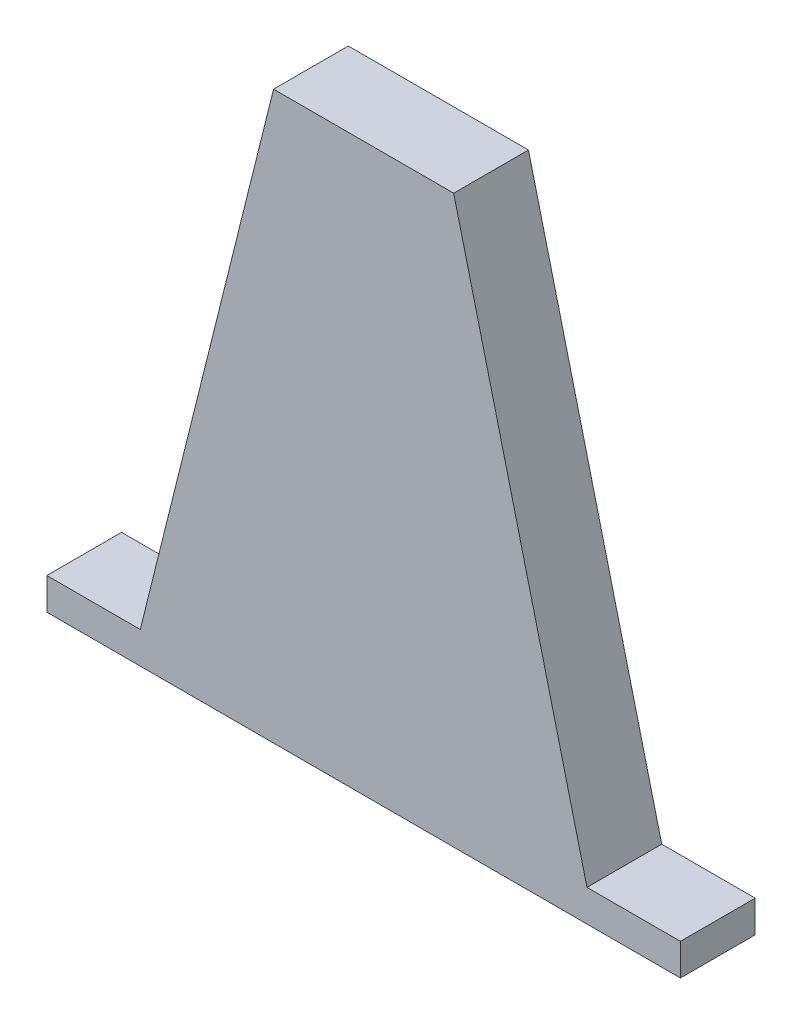
ISO-10303-21;
HEADER;
FILE_DESCRIPTION(('STEP AP214'),'2;1');
FILE_NAME('part.step','',(''),(''),'','','');
FILE_SCHEMA(('AUTOMOTIVE_DESIGN { 1 0 10303 214 1 1 1 1 }'));
ENDSEC;
DATA;
#1=APPLICATION_CONTEXT('core data for automotive mechanical design processes');
#2=APPLICATION_PROTOCOL_DEFINITION('international standard','automotive_design',2000,#1);
#3=PRODUCT_CONTEXT('',#1,'mechanical');
#4=PRODUCT('Part','Part','',(#3));
#5=PRODUCT_RELATED_PRODUCT_CATEGORY('part','',(#4));
#6=PRODUCT_DEFINITION_FORMATION('','',#4);
#7=PRODUCT_DEFINITION_CONTEXT('part definition',#1,'design');
#8=PRODUCT_DEFINITION('design','',#6,#7);
#9=PRODUCT_DEFINITION_SHAPE('','',#8);
#10=(LENGTH_UNIT() NAMED_UNIT(*) SI_UNIT(.MILLI.,.METRE.));
#11=(NAMED_UNIT(*) PLANE_ANGLE_UNIT() SI_UNIT($,.RADIAN.));
#12=(NAMED_UNIT(*) SI_UNIT($,.STERADIAN.) SOLID_ANGLE_UNIT());
#13=UNCERTAINTY_MEASURE_WITH_UNIT(LENGTH_MEASURE(1.E-05),#10,'distance_accuracy_value','');
#14=(GEOMETRIC_REPRESENTATION_CONTEXT(3) GLOBAL_UNCERTAINTY_ASSIGNED_CONTEXT((#13)) GLOBAL_UNIT_ASSIGNED_CONTEXT((#10,
#11,#12)) REPRESENTATION_CONTEXT('',''));
#15=CARTESIAN_POINT('',(0.,0.,0.));
#16=DIRECTION('',(0.,0.,1.));
#17=DIRECTION('',(1.,0.,0.));
#18=AXIS2_PLACEMENT_3D('',#15,#16,#17);
#19=CARTESIAN_POINT('',(-85.5,-76.5,20.));
#20=DIRECTION('',(1.,0.,0.));
#21=DIRECTION('',(0.,0.,-1.));
#22=AXIS2_PLACEMENT_3D('',#19,#20,#21);
#23=PLANE('',#22);
#24=DIRECTION('',(0.,-1.,0.));
#25=VECTOR('',#24,1.);
#26=CARTESIAN_POINT('',(-85.5,-76.5,0.));
#27=LINE('',#26,#25);
#28=CARTESIAN_POINT('',(-85.5,-68.,0.));
#29=VERTEX_POINT('',#28);
#30=CARTESIAN_POINT('',(-85.5,-76.5,0.));
#31=VERTEX_POINT('',#30);
#32=EDGE_CURVE('E128',#29,#31,#27,.T.);
#33=ORIENTED_EDGE('',*,*,#32,.T.);
#34=DIRECTION('',(0.,0.,-1.));
#35=VECTOR('',#34,1.);
#36=CARTESIAN_POINT('',(-85.5,-76.5,20.));
#37=LINE('',#36,#35);
#38=CARTESIAN_POINT('',(-85.5,-76.5,20.));
#39=VERTEX_POINT('',#38);
#40=EDGE_CURVE('E11',#39,#31,#37,.T.);
#41=ORIENTED_EDGE('',*,*,#40,.F.);
#42=DIRECTION('',(0.,-1.,0.));
#43=VECTOR('',#42,1.);
#44=CARTESIAN_POINT('',(-85.5,-76.5,20.));
#45=LINE('',#44,#43);
#46=CARTESIAN_POINT('',(-85.5,-68.,20.));
#47=VERTEX_POINT('',#46);
#48=EDGE_CURVE('E142',#47,#39,#45,.T.);
#49=ORIENTED_EDGE('',*,*,#48,.F.);
#50=DIRECTION('',(0.,0.,-1.));
#51=VECTOR('',#50,1.);
#52=CARTESIAN_POINT('',(-85.5,-68.,20.));
#53=LINE('',#52,#51);
#54=EDGE_CURVE('E124',#47,#29,#53,.T.);
#55=ORIENTED_EDGE('',*,*,#54,.T.);
#56=EDGE_LOOP('',(#33,#41,#49,#55));
#57=FACE_BOUND('',#56,.T.);
#58=ADVANCED_FACE('F32',(#57),#23,.F.);
#59=CARTESIAN_POINT('',(84.,-76.5,20.));
#60=DIRECTION('',(0.,1.,0.));
#61=DIRECTION('',(-1.,0.,0.));
#62=AXIS2_PLACEMENT_3D('',#59,#60,#61);
#63=PLANE('',#62);
#64=DIRECTION('',(1.,0.,0.));
#65=VECTOR('',#64,1.);
#66=CARTESIAN_POINT('',(84.,-76.5,0.));
#67=LINE('',#66,#65);
#68=CARTESIAN_POINT('',(84.,-76.5,0.));
#69=VERTEX_POINT('',#68);
#70=EDGE_CURVE('E131',#31,#69,#67,.T.);
#71=ORIENTED_EDGE('',*,*,#70,.T.);
#72=DIRECTION('',(0.,0.,-1.));
#73=VECTOR('',#72,1.);
#74=CARTESIAN_POINT('',(84.,-76.5,20.));
#75=LINE('',#74,#73);
#76=CARTESIAN_POINT('',(84.,-76.5,20.));
#77=VERTEX_POINT('',#76);
#78=EDGE_CURVE('E40',#77,#69,#75,.T.);
#79=ORIENTED_EDGE('',*,*,#78,.F.);
#80=DIRECTION('',(1.,0.,0.));
#81=VECTOR('',#80,1.);
#82=CARTESIAN_POINT('',(84.,-76.5,20.));
#83=LINE('',#82,#81);
#84=EDGE_CURVE('E91',#39,#77,#83,.T.);
#85=ORIENTED_EDGE('',*,*,#84,.F.);
#86=ORIENTED_EDGE('',*,*,#40,.T.);
#87=EDGE_LOOP('',(#71,#79,#85,#86));
#88=FACE_BOUND('',#87,.T.);
#89=ADVANCED_FACE('F177',(#88),#63,.F.);
#90=CARTESIAN_POINT('',(84.,-68.,20.));
#91=DIRECTION('',(-1.,0.,0.));
#92=DIRECTION('',(0.,-1.,0.));
#93=AXIS2_PLACEMENT_3D('',#90,#91,#92);
#94=PLANE('',#93);
#95=DIRECTION('',(0.,1.,0.));
#96=VECTOR('',#95,1.);
#97=CARTESIAN_POINT('',(84.,-68.,0.));
#98=LINE('',#97,#96);
#99=CARTESIAN_POINT('',(84.,-68.,0.));
#100=VERTEX_POINT('',#99);
#101=EDGE_CURVE('E133',#69,#100,#98,.T.);
#102=ORIENTED_EDGE('',*,*,#101,.T.);
#103=DIRECTION('',(0.,0.,-1.));
#104=VECTOR('',#103,1.);
#105=CARTESIAN_POINT('',(84.,-68.,20.));
#106=LINE('',#105,#104);
#107=CARTESIAN_POINT('',(84.,-68.,20.));
#108=VERTEX_POINT('',#107);
#109=EDGE_CURVE('E149',#108,#100,#106,.T.);
#110=ORIENTED_EDGE('',*,*,#109,.F.);
#111=DIRECTION('',(0.,1.,0.));
#112=VECTOR('',#111,1.);
#113=CARTESIAN_POINT('',(84.,-68.,20.));
#114=LINE('',#113,#112);
#115=EDGE_CURVE('E157',#77,#108,#114,.T.);
#116=ORIENTED_EDGE('',*,*,#115,.F.);
#117=ORIENTED_EDGE('',*,*,#78,.T.);
#118=EDGE_LOOP('',(#102,#110,#116,#117));
#119=FACE_BOUND('',#118,.T.);
#120=ADVANCED_FACE('F155',(#119),#94,.F.);
#121=CARTESIAN_POINT('',(59.,-68.,20.));
#122=DIRECTION('',(0.,-1.,0.));
#123=DIRECTION('',(0.,0.,-1.));
#124=AXIS2_PLACEMENT_3D('',#121,#122,#123);
#125=PLANE('',#124);
#126=DIRECTION('',(-1.,0.,0.));
#127=VECTOR('',#126,1.);
#128=CARTESIAN_POINT('',(59.,-68.,0.));
#129=LINE('',#128,#127);
#130=CARTESIAN_POINT('',(59.,-68.,0.));
#131=VERTEX_POINT('',#130);
#132=EDGE_CURVE('E135',#100,#131,#129,.T.);
#133=ORIENTED_EDGE('',*,*,#132,.T.);
#134=DIRECTION('',(0.,0.,-1.));
#135=VECTOR('',#134,1.);
#136=CARTESIAN_POINT('',(59.,-68.,20.));
#137=LINE('',#136,#135);
#138=CARTESIAN_POINT('',(59.,-68.,20.));
#139=VERTEX_POINT('',#138);
#140=EDGE_CURVE('E146',#139,#131,#137,.T.);
#141=ORIENTED_EDGE('',*,*,#140,.F.);
#142=DIRECTION('',(-1.,0.,0.));
#143=VECTOR('',#142,1.);
#144=CARTESIAN_POINT('',(59.,-68.,20.));
#145=LINE('',#144,#143);
#146=EDGE_CURVE('E169',#108,#139,#145,.T.);
#147=ORIENTED_EDGE('',*,*,#146,.F.);
#148=ORIENTED_EDGE('',*,*,#109,.T.);
#149=EDGE_LOOP('',(#133,#141,#147,#148));
#150=FACE_BOUND('',#149,.T.);
#151=ADVANCED_FACE('F165',(#150),#125,.F.);
#152=CARTESIAN_POINT('',(59.,-68.,20.));
#153=DIRECTION('',(-0.970295726275995,-0.241921895599672,0.));
#154=DIRECTION('',(0.241921895599672,-0.970295726275996,0.));
#155=AXIS2_PLACEMENT_3D('',#152,#153,#154);
#156=PLANE('',#155);
#157=DIRECTION('',(-0.241921895599672,0.970295726275995,0.));
#158=VECTOR('',#157,1.);
#159=CARTESIAN_POINT('',(59.,-68.,0.));
#160=LINE('',#159,#158);
#161=CARTESIAN_POINT('',(23.3460955934245,75.,0.));
#162=VERTEX_POINT('',#161);
#163=EDGE_CURVE('E137',#131,#162,#160,.T.);
#164=ORIENTED_EDGE('',*,*,#163,.T.);
#165=DIRECTION('',(0.,0.,-1.));
#166=VECTOR('',#165,1.);
#167=CARTESIAN_POINT('',(23.3460955934245,75.,20.));
#168=LINE('',#167,#166);
#169=CARTESIAN_POINT('',(23.3460955934245,75.,20.));
#170=VERTEX_POINT('',#169);
#171=EDGE_CURVE('E119',#170,#162,#168,.T.);
#172=ORIENTED_EDGE('',*,*,#171,.F.);
#173=DIRECTION('',(-0.241921895599672,0.970295726275995,0.));
#174=VECTOR('',#173,1.);
#175=CARTESIAN_POINT('',(59.,-68.,20.));
#176=LINE('',#175,#174);
#177=EDGE_CURVE('E110',#139,#170,#176,.T.);
#178=ORIENTED_EDGE('',*,*,#177,.F.);
#179=ORIENTED_EDGE('',*,*,#140,.T.);
#180=EDGE_LOOP('',(#164,#172,#178,#179));
#181=FACE_BOUND('',#180,.T.);
#182=ADVANCED_FACE('F168',(#181),#156,.F.);
#183=CARTESIAN_POINT('',(-24.8460955934245,75.,20.));
#184=DIRECTION('',(0.,-1.,0.));
#185=DIRECTION('',(1.,0.,0.));
#186=AXIS2_PLACEMENT_3D('',#183,#184,#185);
#187=PLANE('',#186);
#188=DIRECTION('',(-1.,0.,0.));
#189=VECTOR('',#188,1.);
#190=CARTESIAN_POINT('',(-24.8460955934245,75.,0.));
#191=LINE('',#190,#189);
#192=CARTESIAN_POINT('',(-24.8460955934245,75.,0.));
#193=VERTEX_POINT('',#192);
#194=EDGE_CURVE('E118',#162,#193,#191,.T.);
#195=ORIENTED_EDGE('',*,*,#194,.T.);
#196=DIRECTION('',(0.,0.,-1.));
#197=VECTOR('',#196,1.);
#198=CARTESIAN_POINT('',(-24.8460955934245,75.,20.));
#199=LINE('',#198,#197);
#200=CARTESIAN_POINT('',(-24.8460955934245,75.,20.));
#201=VERTEX_POINT('',#200);
#202=EDGE_CURVE('E115',#201,#193,#199,.T.);
#203=ORIENTED_EDGE('',*,*,#202,.F.);
#204=DIRECTION('',(-1.,0.,0.));
#205=VECTOR('',#204,1.);
#206=CARTESIAN_POINT('',(-24.8460955934245,75.,20.));
#207=LINE('',#206,#205);
#208=EDGE_CURVE('E104',#170,#201,#207,.T.);
#209=ORIENTED_EDGE('',*,*,#208,.F.);
#210=ORIENTED_EDGE('',*,*,#171,.T.);
#211=EDGE_LOOP('',(#195,#203,#209,#210));
#212=FACE_BOUND('',#211,.T.);
#213=ADVANCED_FACE('F116',(#212),#187,.F.);
#214=CARTESIAN_POINT('',(-24.8460955934245,75.,20.));
#215=DIRECTION('',(0.970295726275996,-0.241921895599672,0.));
#216=DIRECTION('',(0.241921895599672,0.970295726275996,0.));
#217=AXIS2_PLACEMENT_3D('',#214,#215,#216);
#218=PLANE('',#217);
#219=DIRECTION('',(-0.241921895599672,-0.970295726275995,0.));
#220=VECTOR('',#219,1.);
#221=CARTESIAN_POINT('',(-24.8460955934245,75.,0.));
#222=LINE('',#221,#220);
#223=CARTESIAN_POINT('',(-60.5,-68.,0.));
#224=VERTEX_POINT('',#223);
#225=EDGE_CURVE('E77',#193,#224,#222,.T.);
#226=ORIENTED_EDGE('',*,*,#225,.T.);
#227=DIRECTION('',(0.,0.,-1.));
#228=VECTOR('',#227,1.);
#229=CARTESIAN_POINT('',(-60.5,-68.,20.));
#230=LINE('',#229,#228);
#231=CARTESIAN_POINT('',(-60.5,-68.,20.));
#232=VERTEX_POINT('',#231);
#233=EDGE_CURVE('E120',#232,#224,#230,.T.);
#234=ORIENTED_EDGE('',*,*,#233,.F.);
#235=DIRECTION('',(-0.241921895599672,-0.970295726275995,0.));
#236=VECTOR('',#235,1.);
#237=CARTESIAN_POINT('',(-24.8460955934245,75.,20.));
#238=LINE('',#237,#236);
#239=EDGE_CURVE('E108',#201,#232,#238,.T.);
#240=ORIENTED_EDGE('',*,*,#239,.F.);
#241=ORIENTED_EDGE('',*,*,#202,.T.);
#242=EDGE_LOOP('',(#226,#234,#240,#241));
#243=FACE_BOUND('',#242,.T.);
#244=ADVANCED_FACE('F122',(#243),#218,.F.);
#245=CARTESIAN_POINT('',(-85.5,-68.,20.));
#246=DIRECTION('',(0.,-1.,0.));
#247=DIRECTION('',(0.,0.,-1.));
#248=AXIS2_PLACEMENT_3D('',#245,#246,#247);
#249=PLANE('',#248);
#250=DIRECTION('',(-1.,0.,0.));
#251=VECTOR('',#250,1.);
#252=CARTESIAN_POINT('',(-85.5,-68.,0.));
#253=LINE('',#252,#251);
#254=EDGE_CURVE('E83',#224,#29,#253,.T.);
#255=ORIENTED_EDGE('',*,*,#254,.T.);
#256=ORIENTED_EDGE('',*,*,#54,.F.);
#257=DIRECTION('',(-1.,0.,0.));
#258=VECTOR('',#257,1.);
#259=CARTESIAN_POINT('',(-85.5,-68.,20.));
#260=LINE('',#259,#258);
#261=EDGE_CURVE('E48',#232,#47,#260,.T.);
#262=ORIENTED_EDGE('',*,*,#261,.F.);
#263=ORIENTED_EDGE('',*,*,#233,.T.);
#264=EDGE_LOOP('',(#255,#256,#262,#263));
#265=FACE_BOUND('',#264,.T.);
#266=ADVANCED_FACE('F193',(#265),#249,.F.);
#267=CARTESIAN_POINT('',(0.,0.,20.));
#268=DIRECTION('',(0.,0.,-1.));
#269=DIRECTION('',(-1.,0.,0.));
#270=AXIS2_PLACEMENT_3D('',#267,#268,#269);
#271=PLANE('',#270);
#272=ORIENTED_EDGE('',*,*,#48,.T.);
#273=ORIENTED_EDGE('',*,*,#84,.T.);
#274=ORIENTED_EDGE('',*,*,#115,.T.);
#275=ORIENTED_EDGE('',*,*,#146,.T.);
#276=ORIENTED_EDGE('',*,*,#177,.T.);
#277=ORIENTED_EDGE('',*,*,#208,.T.);
#278=ORIENTED_EDGE('',*,*,#239,.T.);
#279=ORIENTED_EDGE('',*,*,#261,.T.);
#280=EDGE_LOOP('',(#272,#273,#274,#275,#276,#277,#278,#279));
#281=FACE_BOUND('',#280,.T.);
#282=ADVANCED_FACE('F106',(#281),#271,.F.);
#283=CARTESIAN_POINT('',(0.,0.,0.));
#284=DIRECTION('',(0.,0.,-1.));
#285=DIRECTION('',(-1.,0.,0.));
#286=AXIS2_PLACEMENT_3D('',#283,#284,#285);
#287=PLANE('',#286);
#288=ORIENTED_EDGE('',*,*,#32,.F.);
#289=ORIENTED_EDGE('',*,*,#254,.F.);
#290=ORIENTED_EDGE('',*,*,#225,.F.);
#291=ORIENTED_EDGE('',*,*,#194,.F.);
#292=ORIENTED_EDGE('',*,*,#163,.F.);
#293=ORIENTED_EDGE('',*,*,#132,.F.);
#294=ORIENTED_EDGE('',*,*,#101,.F.);
#295=ORIENTED_EDGE('',*,*,#70,.F.);
#296=EDGE_LOOP('',(#288,#289,#290,#291,#292,#293,#294,#295));
#297=FACE_BOUND('',#296,.T.);
#298=ADVANCED_FACE('F161',(#297),#287,.T.);
#299=CLOSED_SHELL('',(#58,#89,#120,#151,#182,#213,#244,#266,#282,#298));
#300=MANIFOLD_SOLID_BREP('B2',#299);
#301=ADVANCED_BREP_SHAPE_REPRESENTATION('',(#18,#300),#14);
#302=SHAPE_DEFINITION_REPRESENTATION(#9,#301);
ENDSEC;
END-ISO-10303-21;
